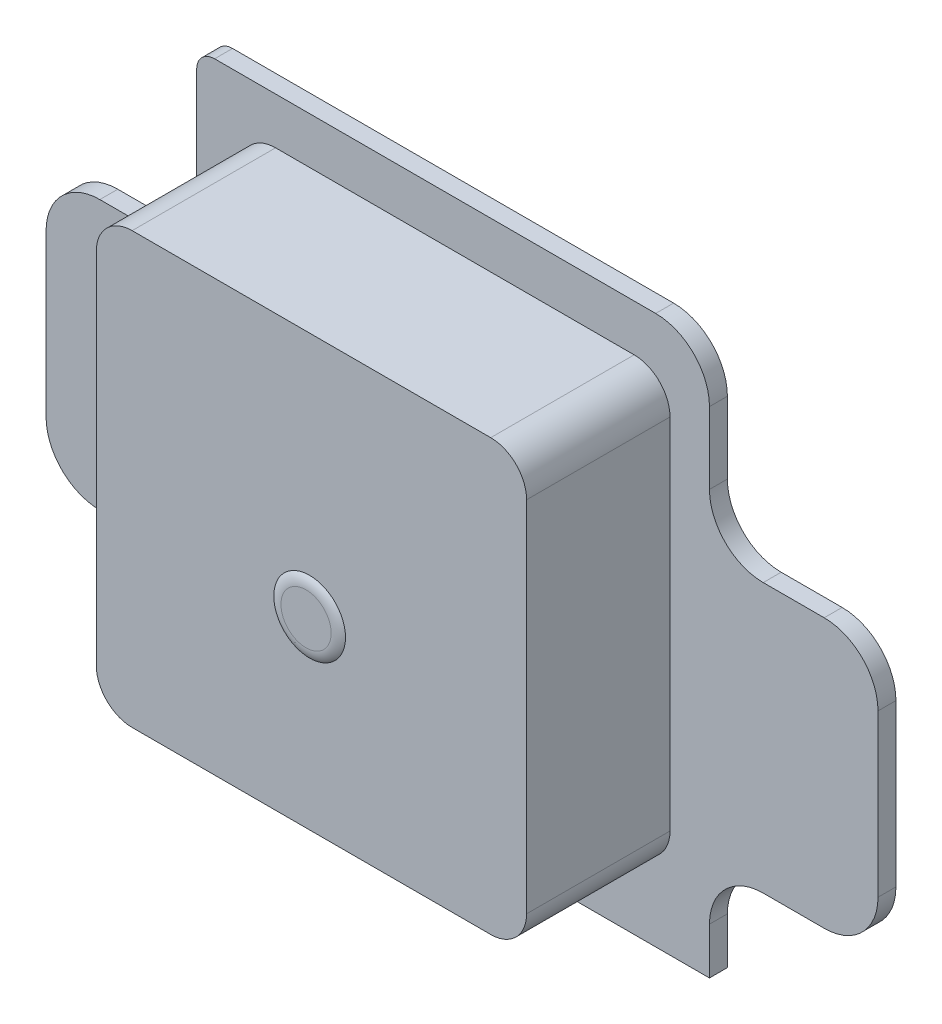
ISO-10303-21;
HEADER;
FILE_DESCRIPTION(('STEP AP214'),'2;1');
FILE_NAME('part.step','',(''),(''),'','','');
FILE_SCHEMA(('AUTOMOTIVE_DESIGN { 1 0 10303 214 1 1 1 1 }'));
ENDSEC;
DATA;
#1=APPLICATION_CONTEXT('core data for automotive mechanical design processes');
#2=APPLICATION_PROTOCOL_DEFINITION('international standard','automotive_design',2000,#1);
#3=PRODUCT_CONTEXT('',#1,'mechanical');
#4=PRODUCT('Part','Part','',(#3));
#5=PRODUCT_RELATED_PRODUCT_CATEGORY('part','',(#4));
#6=PRODUCT_DEFINITION_FORMATION('','',#4);
#7=PRODUCT_DEFINITION_CONTEXT('part definition',#1,'design');
#8=PRODUCT_DEFINITION('design','',#6,#7);
#9=PRODUCT_DEFINITION_SHAPE('','',#8);
#10=(LENGTH_UNIT() NAMED_UNIT(*) SI_UNIT(.MILLI.,.METRE.));
#11=(NAMED_UNIT(*) PLANE_ANGLE_UNIT() SI_UNIT($,.RADIAN.));
#12=(NAMED_UNIT(*) SI_UNIT($,.STERADIAN.) SOLID_ANGLE_UNIT());
#13=UNCERTAINTY_MEASURE_WITH_UNIT(LENGTH_MEASURE(1.E-05),#10,'distance_accuracy_value','');
#14=(GEOMETRIC_REPRESENTATION_CONTEXT(3) GLOBAL_UNCERTAINTY_ASSIGNED_CONTEXT((#13)) GLOBAL_UNIT_ASSIGNED_CONTEXT((#10,
#11,#12)) REPRESENTATION_CONTEXT('',''));
#15=CARTESIAN_POINT('',(0.,0.,0.));
#16=DIRECTION('',(0.,0.,1.));
#17=DIRECTION('',(1.,0.,0.));
#18=AXIS2_PLACEMENT_3D('',#15,#16,#17);
#19=CARTESIAN_POINT('',(0.,0.,0.5));
#20=DIRECTION('',(0.,0.,-1.));
#21=DIRECTION('',(-1.,0.,0.));
#22=AXIS2_PLACEMENT_3D('',#19,#20,#21);
#23=PLANE('',#22);
#24=DIRECTION('',(-1.,0.,0.));
#25=VECTOR('',#24,1.);
#26=CARTESIAN_POINT('',(-7.15,7.65,0.5));
#27=LINE('',#26,#25);
#28=CARTESIAN_POINT('',(5.65,7.65,0.5));
#29=VERTEX_POINT('',#28);
#30=CARTESIAN_POINT('',(-6.65,7.65,0.5));
#31=VERTEX_POINT('',#30);
#32=EDGE_CURVE('E243',#29,#31,#27,.T.);
#33=ORIENTED_EDGE('',*,*,#32,.T.);
#34=CARTESIAN_POINT('',(-6.65,7.15,0.5));
#35=DIRECTION('',(0.,0.,-1.));
#36=DIRECTION('',(-1.,0.,0.));
#37=AXIS2_PLACEMENT_3D('',#34,#35,#36);
#38=CIRCLE('',#37,0.5);
#39=CARTESIAN_POINT('',(-7.15,7.15,0.5));
#40=VERTEX_POINT('',#39);
#41=EDGE_CURVE('E361',#31,#40,#38,.F.);
#42=ORIENTED_EDGE('',*,*,#41,.T.);
#43=DIRECTION('',(0.,-1.,0.));
#44=VECTOR('',#43,1.);
#45=CARTESIAN_POINT('',(-7.15,-7.65,0.5));
#46=LINE('',#45,#44);
#47=CARTESIAN_POINT('',(-7.15,4.15,0.5));
#48=VERTEX_POINT('',#47);
#49=EDGE_CURVE('E242',#40,#48,#46,.T.);
#50=ORIENTED_EDGE('',*,*,#49,.T.);
#51=CARTESIAN_POINT('',(-8.65,4.15,0.5));
#52=DIRECTION('',(0.,0.,-1.));
#53=DIRECTION('',(-1.,0.,0.));
#54=AXIS2_PLACEMENT_3D('',#51,#52,#53);
#55=CIRCLE('',#54,1.5);
#56=CARTESIAN_POINT('',(-8.65,2.65,0.5));
#57=VERTEX_POINT('',#56);
#58=EDGE_CURVE('E349',#48,#57,#55,.T.);
#59=ORIENTED_EDGE('',*,*,#58,.T.);
#60=DIRECTION('',(-1.,0.,0.));
#61=VECTOR('',#60,1.);
#62=CARTESIAN_POINT('',(-7.15,2.65,0.5));
#63=LINE('',#62,#61);
#64=CARTESIAN_POINT('',(-9.85,2.65,0.5));
#65=VERTEX_POINT('',#64);
#66=EDGE_CURVE('E445',#57,#65,#63,.T.);
#67=ORIENTED_EDGE('',*,*,#66,.T.);
#68=CARTESIAN_POINT('',(-9.85,1.15,0.5));
#69=DIRECTION('',(0.,0.,-1.));
#70=DIRECTION('',(-1.,0.,0.));
#71=AXIS2_PLACEMENT_3D('',#68,#69,#70);
#72=CIRCLE('',#71,1.5);
#73=CARTESIAN_POINT('',(-11.35,1.15,0.5));
#74=VERTEX_POINT('',#73);
#75=EDGE_CURVE('E290',#65,#74,#72,.F.);
#76=ORIENTED_EDGE('',*,*,#75,.T.);
#77=DIRECTION('',(0.,-1.,0.));
#78=VECTOR('',#77,1.);
#79=CARTESIAN_POINT('',(-11.35,2.65,0.5));
#80=LINE('',#79,#78);
#81=CARTESIAN_POINT('',(-11.35,-3.35,0.5));
#82=VERTEX_POINT('',#81);
#83=EDGE_CURVE('E465',#74,#82,#80,.T.);
#84=ORIENTED_EDGE('',*,*,#83,.T.);
#85=CARTESIAN_POINT('',(-9.85,-3.35,0.5));
#86=DIRECTION('',(0.,0.,-1.));
#87=DIRECTION('',(-1.,0.,0.));
#88=AXIS2_PLACEMENT_3D('',#85,#86,#87);
#89=CIRCLE('',#88,1.5);
#90=CARTESIAN_POINT('',(-9.85,-4.85,0.5));
#91=VERTEX_POINT('',#90);
#92=EDGE_CURVE('E292',#82,#91,#89,.F.);
#93=ORIENTED_EDGE('',*,*,#92,.T.);
#94=DIRECTION('',(1.,0.,0.));
#95=VECTOR('',#94,1.);
#96=CARTESIAN_POINT('',(-7.15,-4.85,0.5));
#97=LINE('',#96,#95);
#98=CARTESIAN_POINT('',(-8.65,-4.85,0.5));
#99=VERTEX_POINT('',#98);
#100=EDGE_CURVE('E457',#91,#99,#97,.T.);
#101=ORIENTED_EDGE('',*,*,#100,.T.);
#102=CARTESIAN_POINT('',(-8.65,-6.35,0.5));
#103=DIRECTION('',(0.,0.,-1.));
#104=DIRECTION('',(-1.,0.,0.));
#105=AXIS2_PLACEMENT_3D('',#102,#103,#104);
#106=CIRCLE('',#105,1.5);
#107=CARTESIAN_POINT('',(-7.15,-6.35,0.5));
#108=VERTEX_POINT('',#107);
#109=EDGE_CURVE('E239',#99,#108,#106,.T.);
#110=ORIENTED_EDGE('',*,*,#109,.T.);
#111=CARTESIAN_POINT('',(-7.15,-7.65,0.5));
#112=VERTEX_POINT('',#111);
#113=EDGE_CURVE('E231',#108,#112,#46,.T.);
#114=ORIENTED_EDGE('',*,*,#113,.T.);
#115=DIRECTION('',(1.,0.,0.));
#116=VECTOR('',#115,1.);
#117=CARTESIAN_POINT('',(-7.15,-7.65,0.5));
#118=LINE('',#117,#116);
#119=CARTESIAN_POINT('',(7.15,-7.65,0.5));
#120=VERTEX_POINT('',#119);
#121=EDGE_CURVE('E236',#112,#120,#118,.T.);
#122=ORIENTED_EDGE('',*,*,#121,.T.);
#123=DIRECTION('',(0.,1.,0.));
#124=VECTOR('',#123,1.);
#125=CARTESIAN_POINT('',(7.15,-7.65,0.5));
#126=LINE('',#125,#124);
#127=CARTESIAN_POINT('',(7.15,-6.35,0.5));
#128=VERTEX_POINT('',#127);
#129=EDGE_CURVE('E469',#120,#128,#126,.T.);
#130=ORIENTED_EDGE('',*,*,#129,.T.);
#131=CARTESIAN_POINT('',(8.65,-6.35,0.5));
#132=DIRECTION('',(0.,0.,-1.));
#133=DIRECTION('',(-1.,0.,0.));
#134=AXIS2_PLACEMENT_3D('',#131,#132,#133);
#135=CIRCLE('',#134,1.5);
#136=CARTESIAN_POINT('',(8.65,-4.85,0.5));
#137=VERTEX_POINT('',#136);
#138=EDGE_CURVE('E342',#128,#137,#135,.T.);
#139=ORIENTED_EDGE('',*,*,#138,.T.);
#140=DIRECTION('',(1.,0.,0.));
#141=VECTOR('',#140,1.);
#142=CARTESIAN_POINT('',(7.15,-4.85,0.5));
#143=LINE('',#142,#141);
#144=CARTESIAN_POINT('',(10.35,-4.85,0.5));
#145=VERTEX_POINT('',#144);
#146=EDGE_CURVE('E427',#137,#145,#143,.T.);
#147=ORIENTED_EDGE('',*,*,#146,.T.);
#148=CARTESIAN_POINT('',(10.35,-3.35,0.5));
#149=DIRECTION('',(0.,0.,-1.));
#150=DIRECTION('',(-1.,0.,0.));
#151=AXIS2_PLACEMENT_3D('',#148,#149,#150);
#152=CIRCLE('',#151,1.5);
#153=CARTESIAN_POINT('',(11.85,-3.35,0.5));
#154=VERTEX_POINT('',#153);
#155=EDGE_CURVE('E294',#145,#154,#152,.F.);
#156=ORIENTED_EDGE('',*,*,#155,.T.);
#157=DIRECTION('',(0.,1.,0.));
#158=VECTOR('',#157,1.);
#159=CARTESIAN_POINT('',(11.85,2.65,0.5));
#160=LINE('',#159,#158);
#161=CARTESIAN_POINT('',(11.85,1.15,0.5));
#162=VERTEX_POINT('',#161);
#163=EDGE_CURVE('E448',#154,#162,#160,.T.);
#164=ORIENTED_EDGE('',*,*,#163,.T.);
#165=CARTESIAN_POINT('',(10.35,1.15,0.5));
#166=DIRECTION('',(0.,0.,-1.));
#167=DIRECTION('',(-1.,0.,0.));
#168=AXIS2_PLACEMENT_3D('',#165,#166,#167);
#169=CIRCLE('',#168,1.5);
#170=CARTESIAN_POINT('',(10.35,2.65,0.5));
#171=VERTEX_POINT('',#170);
#172=EDGE_CURVE('E296',#162,#171,#169,.F.);
#173=ORIENTED_EDGE('',*,*,#172,.T.);
#174=DIRECTION('',(-1.,0.,0.));
#175=VECTOR('',#174,1.);
#176=CARTESIAN_POINT('',(7.15,2.65,0.5));
#177=LINE('',#176,#175);
#178=CARTESIAN_POINT('',(8.65,2.65,0.5));
#179=VERTEX_POINT('',#178);
#180=EDGE_CURVE('E439',#171,#179,#177,.T.);
#181=ORIENTED_EDGE('',*,*,#180,.T.);
#182=CARTESIAN_POINT('',(8.65,4.15,0.5));
#183=DIRECTION('',(0.,0.,-1.));
#184=DIRECTION('',(-1.,0.,0.));
#185=AXIS2_PLACEMENT_3D('',#182,#183,#184);
#186=CIRCLE('',#185,1.5);
#187=CARTESIAN_POINT('',(7.15,4.15,0.5));
#188=VERTEX_POINT('',#187);
#189=EDGE_CURVE('E338',#179,#188,#186,.T.);
#190=ORIENTED_EDGE('',*,*,#189,.T.);
#191=CARTESIAN_POINT('',(7.15,6.15,0.5));
#192=VERTEX_POINT('',#191);
#193=EDGE_CURVE('E272',#188,#192,#126,.T.);
#194=ORIENTED_EDGE('',*,*,#193,.T.);
#195=CARTESIAN_POINT('',(5.65,6.15,0.5));
#196=DIRECTION('',(0.,0.,-1.));
#197=DIRECTION('',(-1.,0.,0.));
#198=AXIS2_PLACEMENT_3D('',#195,#196,#197);
#199=CIRCLE('',#198,1.5);
#200=EDGE_CURVE('E298',#192,#29,#199,.F.);
#201=ORIENTED_EDGE('',*,*,#200,.T.);
#202=EDGE_LOOP('',(#33,#42,#50,#59,#67,#76,#84,#93,#101,#110,#114,#122,#130,#139,#147,#156,#164,
#173,#181,#190,#194,#201));
#203=FACE_BOUND('',#202,.T.);
#204=DIRECTION('',(0.,-1.,0.));
#205=VECTOR('',#204,1.);
#206=CARTESIAN_POINT('',(-5.95,6.35,0.5));
#207=LINE('',#206,#205);
#208=CARTESIAN_POINT('',(-5.95,5.35,0.5));
#209=VERTEX_POINT('',#208);
#210=CARTESIAN_POINT('',(-5.94999999999999,-4.65,0.5));
#211=VERTEX_POINT('',#210);
#212=EDGE_CURVE('E396',#209,#211,#207,.T.);
#213=ORIENTED_EDGE('',*,*,#212,.F.);
#214=CARTESIAN_POINT('',(-4.95,5.35,0.5));
#215=DIRECTION('',(0.,0.,-1.));
#216=DIRECTION('',(-1.,0.,0.));
#217=AXIS2_PLACEMENT_3D('',#214,#215,#216);
#218=CIRCLE('',#217,1.);
#219=CARTESIAN_POINT('',(-4.95,6.35,0.5));
#220=VERTEX_POINT('',#219);
#221=EDGE_CURVE('E390',#209,#220,#218,.T.);
#222=ORIENTED_EDGE('',*,*,#221,.T.);
#223=DIRECTION('',(-1.,0.,0.));
#224=VECTOR('',#223,1.);
#225=CARTESIAN_POINT('',(-5.95,6.35,0.5));
#226=LINE('',#225,#224);
#227=CARTESIAN_POINT('',(5.05,6.35,0.5));
#228=VERTEX_POINT('',#227);
#229=EDGE_CURVE('E423',#228,#220,#226,.T.);
#230=ORIENTED_EDGE('',*,*,#229,.F.);
#231=CARTESIAN_POINT('',(5.05,5.35,0.5));
#232=DIRECTION('',(0.,0.,-1.));
#233=DIRECTION('',(-1.,0.,0.));
#234=AXIS2_PLACEMENT_3D('',#231,#232,#233);
#235=CIRCLE('',#234,1.);
#236=CARTESIAN_POINT('',(6.05,5.35,0.5));
#237=VERTEX_POINT('',#236);
#238=EDGE_CURVE('E392',#228,#237,#235,.T.);
#239=ORIENTED_EDGE('',*,*,#238,.T.);
#240=DIRECTION('',(0.,1.,0.));
#241=VECTOR('',#240,1.);
#242=CARTESIAN_POINT('',(6.05,6.35,0.5));
#243=LINE('',#242,#241);
#244=CARTESIAN_POINT('',(6.05000000000001,-4.65,0.5));
#245=VERTEX_POINT('',#244);
#246=EDGE_CURVE('E430',#245,#237,#243,.T.);
#247=ORIENTED_EDGE('',*,*,#246,.F.);
#248=CARTESIAN_POINT('',(5.05000000000001,-4.65,0.5));
#249=DIRECTION('',(0.,0.,-1.));
#250=DIRECTION('',(-1.,0.,0.));
#251=AXIS2_PLACEMENT_3D('',#248,#249,#250);
#252=CIRCLE('',#251,1.);
#253=CARTESIAN_POINT('',(5.05000000000001,-5.65,0.5));
#254=VERTEX_POINT('',#253);
#255=EDGE_CURVE('E49',#245,#254,#252,.T.);
#256=ORIENTED_EDGE('',*,*,#255,.T.);
#257=DIRECTION('',(1.,0.,0.));
#258=VECTOR('',#257,1.);
#259=CARTESIAN_POINT('',(-5.94999999999999,-5.65,0.5));
#260=LINE('',#259,#258);
#261=CARTESIAN_POINT('',(-4.94999999999999,-5.65,0.5));
#262=VERTEX_POINT('',#261);
#263=EDGE_CURVE('E397',#262,#254,#260,.T.);
#264=ORIENTED_EDGE('',*,*,#263,.F.);
#265=CARTESIAN_POINT('',(-4.94999999999999,-4.65,0.5));
#266=DIRECTION('',(0.,0.,-1.));
#267=DIRECTION('',(-1.,0.,0.));
#268=AXIS2_PLACEMENT_3D('',#265,#266,#267);
#269=CIRCLE('',#268,1.);
#270=EDGE_CURVE('E42',#262,#211,#269,.T.);
#271=ORIENTED_EDGE('',*,*,#270,.T.);
#272=EDGE_LOOP('',(#213,#222,#230,#239,#247,#256,#264,#271));
#273=FACE_BOUND('',#272,.T.);
#274=ADVANCED_FACE('F34',(#203,#273),#23,.F.);
#275=CARTESIAN_POINT('',(7.15,-7.65,0.5));
#276=DIRECTION('',(-1.,0.,0.));
#277=DIRECTION('',(0.,0.,1.));
#278=AXIS2_PLACEMENT_3D('',#275,#276,#277);
#279=PLANE('',#278);
#280=DIRECTION('',(0.,1.,0.));
#281=VECTOR('',#280,1.);
#282=CARTESIAN_POINT('',(7.15,-7.65,0.));
#283=LINE('',#282,#281);
#284=CARTESIAN_POINT('',(7.15,4.15,0.));
#285=VERTEX_POINT('',#284);
#286=CARTESIAN_POINT('',(7.15,6.15,0.));
#287=VERTEX_POINT('',#286);
#288=EDGE_CURVE('E266',#285,#287,#283,.T.);
#289=ORIENTED_EDGE('',*,*,#288,.T.);
#290=DIRECTION('',(0.,0.,-1.));
#291=VECTOR('',#290,1.);
#292=CARTESIAN_POINT('',(7.15,6.15,0.5));
#293=LINE('',#292,#291);
#294=EDGE_CURVE('E288',#287,#192,#293,.F.);
#295=ORIENTED_EDGE('',*,*,#294,.T.);
#296=ORIENTED_EDGE('',*,*,#193,.F.);
#297=DIRECTION('',(0.,0.,1.));
#298=VECTOR('',#297,1.);
#299=CARTESIAN_POINT('',(7.15,4.15,0.5));
#300=LINE('',#299,#298);
#301=EDGE_CURVE('E286',#188,#285,#300,.F.);
#302=ORIENTED_EDGE('',*,*,#301,.T.);
#303=EDGE_LOOP('',(#289,#295,#296,#302));
#304=FACE_BOUND('',#303,.T.);
#305=ADVANCED_FACE('F557',(#304),#279,.F.);
#306=CARTESIAN_POINT('',(-7.15,-7.65,0.5));
#307=DIRECTION('',(1.,0.,0.));
#308=DIRECTION('',(0.,0.,-1.));
#309=AXIS2_PLACEMENT_3D('',#306,#307,#308);
#310=PLANE('',#309);
#311=ORIENTED_EDGE('',*,*,#113,.F.);
#312=DIRECTION('',(0.,0.,1.));
#313=VECTOR('',#312,1.);
#314=CARTESIAN_POINT('',(-7.15,-6.35,0.5));
#315=LINE('',#314,#313);
#316=CARTESIAN_POINT('',(-7.15,-6.35,0.));
#317=VERTEX_POINT('',#316);
#318=EDGE_CURVE('E323',#108,#317,#315,.F.);
#319=ORIENTED_EDGE('',*,*,#318,.T.);
#320=DIRECTION('',(0.,-1.,0.));
#321=VECTOR('',#320,1.);
#322=CARTESIAN_POINT('',(-7.15,-7.65,0.));
#323=LINE('',#322,#321);
#324=CARTESIAN_POINT('',(-7.15,-7.65,0.));
#325=VERTEX_POINT('',#324);
#326=EDGE_CURVE('E249',#317,#325,#323,.T.);
#327=ORIENTED_EDGE('',*,*,#326,.T.);
#328=DIRECTION('',(0.,0.,-1.));
#329=VECTOR('',#328,1.);
#330=CARTESIAN_POINT('',(-7.15,-7.65,0.5));
#331=LINE('',#330,#329);
#332=EDGE_CURVE('E246',#112,#325,#331,.T.);
#333=ORIENTED_EDGE('',*,*,#332,.F.);
#334=EDGE_LOOP('',(#311,#319,#327,#333));
#335=FACE_BOUND('',#334,.T.);
#336=ADVANCED_FACE('F247',(#335),#310,.F.);
#337=CARTESIAN_POINT('',(7.15,-7.65,0.));
#338=VERTEX_POINT('',#337);
#339=CARTESIAN_POINT('',(7.15,-6.35,0.));
#340=VERTEX_POINT('',#339);
#341=EDGE_CURVE('E262',#338,#340,#283,.T.);
#342=ORIENTED_EDGE('',*,*,#341,.T.);
#343=DIRECTION('',(0.,0.,1.));
#344=VECTOR('',#343,1.);
#345=CARTESIAN_POINT('',(7.15,-6.35,0.5));
#346=LINE('',#345,#344);
#347=EDGE_CURVE('E315',#340,#128,#346,.T.);
#348=ORIENTED_EDGE('',*,*,#347,.T.);
#349=ORIENTED_EDGE('',*,*,#129,.F.);
#350=DIRECTION('',(0.,0.,-1.));
#351=VECTOR('',#350,1.);
#352=CARTESIAN_POINT('',(7.15,-7.65,0.5));
#353=LINE('',#352,#351);
#354=EDGE_CURVE('E253',#120,#338,#353,.T.);
#355=ORIENTED_EDGE('',*,*,#354,.T.);
#356=EDGE_LOOP('',(#342,#348,#349,#355));
#357=FACE_BOUND('',#356,.T.);
#358=ADVANCED_FACE('F521',(#357),#279,.F.);
#359=CARTESIAN_POINT('',(-7.15,7.65,0.5));
#360=DIRECTION('',(0.,-1.,0.));
#361=DIRECTION('',(0.,0.,-1.));
#362=AXIS2_PLACEMENT_3D('',#359,#360,#361);
#363=PLANE('',#362);
#364=DIRECTION('',(-1.,0.,0.));
#365=VECTOR('',#364,1.);
#366=CARTESIAN_POINT('',(-7.15,7.65,0.));
#367=LINE('',#366,#365);
#368=CARTESIAN_POINT('',(5.65,7.65,0.));
#369=VERTEX_POINT('',#368);
#370=CARTESIAN_POINT('',(-6.65,7.65,0.));
#371=VERTEX_POINT('',#370);
#372=EDGE_CURVE('E265',#369,#371,#367,.T.);
#373=ORIENTED_EDGE('',*,*,#372,.T.);
#374=DIRECTION('',(0.,0.,-1.));
#375=VECTOR('',#374,1.);
#376=CARTESIAN_POINT('',(-6.65,7.65,0.5));
#377=LINE('',#376,#375);
#378=EDGE_CURVE('E359',#371,#31,#377,.F.);
#379=ORIENTED_EDGE('',*,*,#378,.T.);
#380=ORIENTED_EDGE('',*,*,#32,.F.);
#381=DIRECTION('',(0.,0.,-1.));
#382=VECTOR('',#381,1.);
#383=CARTESIAN_POINT('',(5.65,7.65,0.5));
#384=LINE('',#383,#382);
#385=EDGE_CURVE('E252',#29,#369,#384,.T.);
#386=ORIENTED_EDGE('',*,*,#385,.T.);
#387=EDGE_LOOP('',(#373,#379,#380,#386));
#388=FACE_BOUND('',#387,.T.);
#389=ADVANCED_FACE('F562',(#388),#363,.F.);
#390=ORIENTED_EDGE('',*,*,#49,.F.);
#391=DIRECTION('',(0.,0.,-1.));
#392=VECTOR('',#391,1.);
#393=CARTESIAN_POINT('',(-7.15,7.15,0.5));
#394=LINE('',#393,#392);
#395=CARTESIAN_POINT('',(-7.15,7.15,0.));
#396=VERTEX_POINT('',#395);
#397=EDGE_CURVE('E354',#40,#396,#394,.T.);
#398=ORIENTED_EDGE('',*,*,#397,.T.);
#399=CARTESIAN_POINT('',(-7.15,4.15,0.));
#400=VERTEX_POINT('',#399);
#401=EDGE_CURVE('E269',#396,#400,#323,.T.);
#402=ORIENTED_EDGE('',*,*,#401,.T.);
#403=DIRECTION('',(0.,0.,1.));
#404=VECTOR('',#403,1.);
#405=CARTESIAN_POINT('',(-7.15,4.15,0.5));
#406=LINE('',#405,#404);
#407=EDGE_CURVE('E335',#400,#48,#406,.T.);
#408=ORIENTED_EDGE('',*,*,#407,.T.);
#409=EDGE_LOOP('',(#390,#398,#402,#408));
#410=FACE_BOUND('',#409,.T.);
#411=ADVANCED_FACE('F483',(#410),#310,.F.);
#412=CARTESIAN_POINT('',(-7.15,-7.65,0.5));
#413=DIRECTION('',(0.,1.,0.));
#414=DIRECTION('',(0.,0.,1.));
#415=AXIS2_PLACEMENT_3D('',#412,#413,#414);
#416=PLANE('',#415);
#417=DIRECTION('',(1.,0.,0.));
#418=VECTOR('',#417,1.);
#419=CARTESIAN_POINT('',(-7.15,-7.65,0.));
#420=LINE('',#419,#418);
#421=EDGE_CURVE('E271',#325,#338,#420,.T.);
#422=ORIENTED_EDGE('',*,*,#421,.T.);
#423=ORIENTED_EDGE('',*,*,#354,.F.);
#424=ORIENTED_EDGE('',*,*,#121,.F.);
#425=ORIENTED_EDGE('',*,*,#332,.T.);
#426=EDGE_LOOP('',(#422,#423,#424,#425));
#427=FACE_BOUND('',#426,.T.);
#428=ADVANCED_FACE('F255',(#427),#416,.F.);
#429=CARTESIAN_POINT('',(0.,0.,0.));
#430=DIRECTION('',(0.,0.,-1.));
#431=DIRECTION('',(-1.,0.,0.));
#432=AXIS2_PLACEMENT_3D('',#429,#430,#431);
#433=PLANE('',#432);
#434=ORIENTED_EDGE('',*,*,#401,.F.);
#435=CARTESIAN_POINT('',(-6.65,7.15,0.));
#436=DIRECTION('',(0.,0.,-1.));
#437=DIRECTION('',(-1.,0.,0.));
#438=AXIS2_PLACEMENT_3D('',#435,#436,#437);
#439=CIRCLE('',#438,0.5);
#440=EDGE_CURVE('E357',#396,#371,#439,.T.);
#441=ORIENTED_EDGE('',*,*,#440,.T.);
#442=ORIENTED_EDGE('',*,*,#372,.F.);
#443=CARTESIAN_POINT('',(5.65,6.15,0.));
#444=DIRECTION('',(0.,0.,-1.));
#445=DIRECTION('',(-1.,0.,0.));
#446=AXIS2_PLACEMENT_3D('',#443,#444,#445);
#447=CIRCLE('',#446,1.5);
#448=EDGE_CURVE('E284',#369,#287,#447,.T.);
#449=ORIENTED_EDGE('',*,*,#448,.T.);
#450=ORIENTED_EDGE('',*,*,#288,.F.);
#451=CARTESIAN_POINT('',(8.65,4.15,0.));
#452=DIRECTION('',(0.,0.,-1.));
#453=DIRECTION('',(-1.,0.,0.));
#454=AXIS2_PLACEMENT_3D('',#451,#452,#453);
#455=CIRCLE('',#454,1.5);
#456=CARTESIAN_POINT('',(8.65,2.65,0.));
#457=VERTEX_POINT('',#456);
#458=EDGE_CURVE('E340',#285,#457,#455,.F.);
#459=ORIENTED_EDGE('',*,*,#458,.T.);
#460=DIRECTION('',(-1.,0.,0.));
#461=VECTOR('',#460,1.);
#462=CARTESIAN_POINT('',(7.15,2.65,0.));
#463=LINE('',#462,#461);
#464=CARTESIAN_POINT('',(10.35,2.65,0.));
#465=VERTEX_POINT('',#464);
#466=EDGE_CURVE('E442',#465,#457,#463,.T.);
#467=ORIENTED_EDGE('',*,*,#466,.F.);
#468=CARTESIAN_POINT('',(10.35,1.15,0.));
#469=DIRECTION('',(0.,0.,-1.));
#470=DIRECTION('',(-1.,0.,0.));
#471=AXIS2_PLACEMENT_3D('',#468,#469,#470);
#472=CIRCLE('',#471,1.5);
#473=CARTESIAN_POINT('',(11.85,1.15,0.));
#474=VERTEX_POINT('',#473);
#475=EDGE_CURVE('E282',#465,#474,#472,.T.);
#476=ORIENTED_EDGE('',*,*,#475,.T.);
#477=DIRECTION('',(0.,1.,0.));
#478=VECTOR('',#477,1.);
#479=CARTESIAN_POINT('',(11.85,2.65,0.));
#480=LINE('',#479,#478);
#481=CARTESIAN_POINT('',(11.85,-3.35,0.));
#482=VERTEX_POINT('',#481);
#483=EDGE_CURVE('E438',#482,#474,#480,.T.);
#484=ORIENTED_EDGE('',*,*,#483,.F.);
#485=CARTESIAN_POINT('',(10.35,-3.35,0.));
#486=DIRECTION('',(0.,0.,-1.));
#487=DIRECTION('',(-1.,0.,0.));
#488=AXIS2_PLACEMENT_3D('',#485,#486,#487);
#489=CIRCLE('',#488,1.5);
#490=CARTESIAN_POINT('',(10.35,-4.85,0.));
#491=VERTEX_POINT('',#490);
#492=EDGE_CURVE('E280',#482,#491,#489,.T.);
#493=ORIENTED_EDGE('',*,*,#492,.T.);
#494=DIRECTION('',(1.,0.,0.));
#495=VECTOR('',#494,1.);
#496=CARTESIAN_POINT('',(7.15,-4.85,0.));
#497=LINE('',#496,#495);
#498=CARTESIAN_POINT('',(8.65,-4.85,0.));
#499=VERTEX_POINT('',#498);
#500=EDGE_CURVE('E435',#499,#491,#497,.T.);
#501=ORIENTED_EDGE('',*,*,#500,.F.);
#502=CARTESIAN_POINT('',(8.65,-6.35,0.));
#503=DIRECTION('',(0.,0.,-1.));
#504=DIRECTION('',(-1.,0.,0.));
#505=AXIS2_PLACEMENT_3D('',#502,#503,#504);
#506=CIRCLE('',#505,1.5);
#507=EDGE_CURVE('E344',#499,#340,#506,.F.);
#508=ORIENTED_EDGE('',*,*,#507,.T.);
#509=ORIENTED_EDGE('',*,*,#341,.F.);
#510=ORIENTED_EDGE('',*,*,#421,.F.);
#511=ORIENTED_EDGE('',*,*,#326,.F.);
#512=CARTESIAN_POINT('',(-8.65,-6.35,0.));
#513=DIRECTION('',(0.,0.,-1.));
#514=DIRECTION('',(-1.,0.,0.));
#515=AXIS2_PLACEMENT_3D('',#512,#513,#514);
#516=CIRCLE('',#515,1.5);
#517=CARTESIAN_POINT('',(-8.65,-4.85,0.));
#518=VERTEX_POINT('',#517);
#519=EDGE_CURVE('E347',#317,#518,#516,.F.);
#520=ORIENTED_EDGE('',*,*,#519,.T.);
#521=DIRECTION('',(1.,0.,0.));
#522=VECTOR('',#521,1.);
#523=CARTESIAN_POINT('',(-7.15,-4.85,0.));
#524=LINE('',#523,#522);
#525=CARTESIAN_POINT('',(-9.85,-4.85,0.));
#526=VERTEX_POINT('',#525);
#527=EDGE_CURVE('E460',#526,#518,#524,.T.);
#528=ORIENTED_EDGE('',*,*,#527,.F.);
#529=CARTESIAN_POINT('',(-9.85,-3.35,0.));
#530=DIRECTION('',(0.,0.,-1.));
#531=DIRECTION('',(-1.,0.,0.));
#532=AXIS2_PLACEMENT_3D('',#529,#530,#531);
#533=CIRCLE('',#532,1.5);
#534=CARTESIAN_POINT('',(-11.35,-3.35,0.));
#535=VERTEX_POINT('',#534);
#536=EDGE_CURVE('E278',#526,#535,#533,.T.);
#537=ORIENTED_EDGE('',*,*,#536,.T.);
#538=DIRECTION('',(0.,-1.,0.));
#539=VECTOR('',#538,1.);
#540=CARTESIAN_POINT('',(-11.35,2.65,0.));
#541=LINE('',#540,#539);
#542=CARTESIAN_POINT('',(-11.35,1.15,0.));
#543=VERTEX_POINT('',#542);
#544=EDGE_CURVE('E456',#543,#535,#541,.T.);
#545=ORIENTED_EDGE('',*,*,#544,.F.);
#546=CARTESIAN_POINT('',(-9.85,1.15,0.));
#547=DIRECTION('',(0.,0.,-1.));
#548=DIRECTION('',(-1.,0.,0.));
#549=AXIS2_PLACEMENT_3D('',#546,#547,#548);
#550=CIRCLE('',#549,1.5);
#551=CARTESIAN_POINT('',(-9.85,2.65,0.));
#552=VERTEX_POINT('',#551);
#553=EDGE_CURVE('E276',#543,#552,#550,.T.);
#554=ORIENTED_EDGE('',*,*,#553,.T.);
#555=DIRECTION('',(-1.,0.,0.));
#556=VECTOR('',#555,1.);
#557=CARTESIAN_POINT('',(-7.15,2.65,0.));
#558=LINE('',#557,#556);
#559=CARTESIAN_POINT('',(-8.65,2.65,0.));
#560=VERTEX_POINT('',#559);
#561=EDGE_CURVE('E453',#560,#552,#558,.T.);
#562=ORIENTED_EDGE('',*,*,#561,.F.);
#563=CARTESIAN_POINT('',(-8.65,4.15,0.));
#564=DIRECTION('',(0.,0.,-1.));
#565=DIRECTION('',(-1.,0.,0.));
#566=AXIS2_PLACEMENT_3D('',#563,#564,#565);
#567=CIRCLE('',#566,1.5);
#568=EDGE_CURVE('E351',#560,#400,#567,.F.);
#569=ORIENTED_EDGE('',*,*,#568,.T.);
#570=EDGE_LOOP('',(#434,#441,#442,#449,#450,#459,#467,#476,#484,#493,#501,#508,#509,#510,#511,
#520,#528,#537,#545,#554,#562,#569));
#571=FACE_BOUND('',#570,.T.);
#572=ADVANCED_FACE('F485',(#571),#433,.T.);
#573=CARTESIAN_POINT('',(-7.15,-4.85,0.));
#574=DIRECTION('',(0.,-1.,0.));
#575=DIRECTION('',(1.,0.,0.));
#576=AXIS2_PLACEMENT_3D('',#573,#574,#575);
#577=PLANE('',#576);
#578=ORIENTED_EDGE('',*,*,#527,.T.);
#579=DIRECTION('',(0.,0.,1.));
#580=VECTOR('',#579,1.);
#581=CARTESIAN_POINT('',(-8.65,-4.85,0.));
#582=LINE('',#581,#580);
#583=EDGE_CURVE('E320',#518,#99,#582,.T.);
#584=ORIENTED_EDGE('',*,*,#583,.T.);
#585=ORIENTED_EDGE('',*,*,#100,.F.);
#586=DIRECTION('',(0.,0.,1.));
#587=VECTOR('',#586,1.);
#588=CARTESIAN_POINT('',(-9.85,-4.85,0.));
#589=LINE('',#588,#587);
#590=EDGE_CURVE('E318',#91,#526,#589,.F.);
#591=ORIENTED_EDGE('',*,*,#590,.T.);
#592=EDGE_LOOP('',(#578,#584,#585,#591));
#593=FACE_BOUND('',#592,.T.);
#594=ADVANCED_FACE('F513',(#593),#577,.T.);
#595=CARTESIAN_POINT('',(-11.35,2.65,0.));
#596=DIRECTION('',(-1.,0.,0.));
#597=DIRECTION('',(0.,0.,1.));
#598=AXIS2_PLACEMENT_3D('',#595,#596,#597);
#599=PLANE('',#598);
#600=ORIENTED_EDGE('',*,*,#544,.T.);
#601=DIRECTION('',(0.,0.,1.));
#602=VECTOR('',#601,1.);
#603=CARTESIAN_POINT('',(-11.35,-3.35,0.));
#604=LINE('',#603,#602);
#605=EDGE_CURVE('E327',#535,#82,#604,.T.);
#606=ORIENTED_EDGE('',*,*,#605,.T.);
#607=ORIENTED_EDGE('',*,*,#83,.F.);
#608=DIRECTION('',(0.,0.,1.));
#609=VECTOR('',#608,1.);
#610=CARTESIAN_POINT('',(-11.35,1.15,0.));
#611=LINE('',#610,#609);
#612=EDGE_CURVE('E325',#74,#543,#611,.F.);
#613=ORIENTED_EDGE('',*,*,#612,.T.);
#614=EDGE_LOOP('',(#600,#606,#607,#613));
#615=FACE_BOUND('',#614,.T.);
#616=ADVANCED_FACE('F504',(#615),#599,.T.);
#617=CARTESIAN_POINT('',(-7.15,2.65,0.));
#618=DIRECTION('',(0.,1.,0.));
#619=DIRECTION('',(0.,0.,1.));
#620=AXIS2_PLACEMENT_3D('',#617,#618,#619);
#621=PLANE('',#620);
#622=ORIENTED_EDGE('',*,*,#561,.T.);
#623=DIRECTION('',(0.,0.,1.));
#624=VECTOR('',#623,1.);
#625=CARTESIAN_POINT('',(-9.85,2.65,0.));
#626=LINE('',#625,#624);
#627=EDGE_CURVE('E332',#552,#65,#626,.T.);
#628=ORIENTED_EDGE('',*,*,#627,.T.);
#629=ORIENTED_EDGE('',*,*,#66,.F.);
#630=DIRECTION('',(0.,0.,1.));
#631=VECTOR('',#630,1.);
#632=CARTESIAN_POINT('',(-8.65,2.65,0.));
#633=LINE('',#632,#631);
#634=EDGE_CURVE('E330',#57,#560,#633,.F.);
#635=ORIENTED_EDGE('',*,*,#634,.T.);
#636=EDGE_LOOP('',(#622,#628,#629,#635));
#637=FACE_BOUND('',#636,.T.);
#638=ADVANCED_FACE('F496',(#637),#621,.T.);
#639=CARTESIAN_POINT('',(7.15,2.65,0.));
#640=DIRECTION('',(0.,1.,0.));
#641=DIRECTION('',(-1.,0.,0.));
#642=AXIS2_PLACEMENT_3D('',#639,#640,#641);
#643=PLANE('',#642);
#644=ORIENTED_EDGE('',*,*,#466,.T.);
#645=DIRECTION('',(0.,0.,1.));
#646=VECTOR('',#645,1.);
#647=CARTESIAN_POINT('',(8.65,2.65,0.));
#648=LINE('',#647,#646);
#649=EDGE_CURVE('E302',#457,#179,#648,.T.);
#650=ORIENTED_EDGE('',*,*,#649,.T.);
#651=ORIENTED_EDGE('',*,*,#180,.F.);
#652=DIRECTION('',(0.,0.,1.));
#653=VECTOR('',#652,1.);
#654=CARTESIAN_POINT('',(10.35,2.65,0.));
#655=LINE('',#654,#653);
#656=EDGE_CURVE('E300',#171,#465,#655,.F.);
#657=ORIENTED_EDGE('',*,*,#656,.T.);
#658=EDGE_LOOP('',(#644,#650,#651,#657));
#659=FACE_BOUND('',#658,.T.);
#660=ADVANCED_FACE('F547',(#659),#643,.T.);
#661=CARTESIAN_POINT('',(11.85,2.65,0.));
#662=DIRECTION('',(1.,0.,0.));
#663=DIRECTION('',(0.,0.,-1.));
#664=AXIS2_PLACEMENT_3D('',#661,#662,#663);
#665=PLANE('',#664);
#666=ORIENTED_EDGE('',*,*,#483,.T.);
#667=DIRECTION('',(0.,0.,1.));
#668=VECTOR('',#667,1.);
#669=CARTESIAN_POINT('',(11.85,1.15,0.));
#670=LINE('',#669,#668);
#671=EDGE_CURVE('E307',#474,#162,#670,.T.);
#672=ORIENTED_EDGE('',*,*,#671,.T.);
#673=ORIENTED_EDGE('',*,*,#163,.F.);
#674=DIRECTION('',(0.,0.,1.));
#675=VECTOR('',#674,1.);
#676=CARTESIAN_POINT('',(11.85,-3.35,0.));
#677=LINE('',#676,#675);
#678=EDGE_CURVE('E305',#154,#482,#677,.F.);
#679=ORIENTED_EDGE('',*,*,#678,.T.);
#680=EDGE_LOOP('',(#666,#672,#673,#679));
#681=FACE_BOUND('',#680,.T.);
#682=ADVANCED_FACE('F539',(#681),#665,.T.);
#683=CARTESIAN_POINT('',(7.15,-4.85,0.));
#684=DIRECTION('',(0.,-1.,0.));
#685=DIRECTION('',(0.,0.,-1.));
#686=AXIS2_PLACEMENT_3D('',#683,#684,#685);
#687=PLANE('',#686);
#688=ORIENTED_EDGE('',*,*,#500,.T.);
#689=DIRECTION('',(0.,0.,1.));
#690=VECTOR('',#689,1.);
#691=CARTESIAN_POINT('',(10.35,-4.85,0.));
#692=LINE('',#691,#690);
#693=EDGE_CURVE('E312',#491,#145,#692,.T.);
#694=ORIENTED_EDGE('',*,*,#693,.T.);
#695=ORIENTED_EDGE('',*,*,#146,.F.);
#696=DIRECTION('',(0.,0.,1.));
#697=VECTOR('',#696,1.);
#698=CARTESIAN_POINT('',(8.65,-4.85,0.));
#699=LINE('',#698,#697);
#700=EDGE_CURVE('E310',#137,#499,#699,.F.);
#701=ORIENTED_EDGE('',*,*,#700,.T.);
#702=EDGE_LOOP('',(#688,#694,#695,#701));
#703=FACE_BOUND('',#702,.T.);
#704=ADVANCED_FACE('F527',(#703),#687,.T.);
#705=CARTESIAN_POINT('',(5.65,6.15,0.5));
#706=DIRECTION('',(0.,0.,-1.));
#707=DIRECTION('',(-1.,0.,0.));
#708=AXIS2_PLACEMENT_3D('',#705,#706,#707);
#709=CYLINDRICAL_SURFACE('',#708,1.5);
#710=ORIENTED_EDGE('',*,*,#200,.F.);
#711=ORIENTED_EDGE('',*,*,#294,.F.);
#712=ORIENTED_EDGE('',*,*,#448,.F.);
#713=ORIENTED_EDGE('',*,*,#385,.F.);
#714=EDGE_LOOP('',(#710,#711,#712,#713));
#715=FACE_BOUND('',#714,.T.);
#716=ADVANCED_FACE('F561',(#715),#709,.T.);
#717=CARTESIAN_POINT('',(8.65,4.15,0.));
#718=DIRECTION('',(0.,0.,1.));
#719=DIRECTION('',(1.,0.,0.));
#720=AXIS2_PLACEMENT_3D('',#717,#718,#719);
#721=CYLINDRICAL_SURFACE('',#720,1.5);
#722=ORIENTED_EDGE('',*,*,#458,.F.);
#723=ORIENTED_EDGE('',*,*,#301,.F.);
#724=ORIENTED_EDGE('',*,*,#189,.F.);
#725=ORIENTED_EDGE('',*,*,#649,.F.);
#726=EDGE_LOOP('',(#722,#723,#724,#725));
#727=FACE_BOUND('',#726,.T.);
#728=ADVANCED_FACE('F552',(#727),#721,.F.);
#729=CARTESIAN_POINT('',(10.35,1.15,0.));
#730=DIRECTION('',(0.,0.,1.));
#731=DIRECTION('',(1.,0.,0.));
#732=AXIS2_PLACEMENT_3D('',#729,#730,#731);
#733=CYLINDRICAL_SURFACE('',#732,1.5);
#734=ORIENTED_EDGE('',*,*,#475,.F.);
#735=ORIENTED_EDGE('',*,*,#656,.F.);
#736=ORIENTED_EDGE('',*,*,#172,.F.);
#737=ORIENTED_EDGE('',*,*,#671,.F.);
#738=EDGE_LOOP('',(#734,#735,#736,#737));
#739=FACE_BOUND('',#738,.T.);
#740=ADVANCED_FACE('F543',(#739),#733,.T.);
#741=CARTESIAN_POINT('',(10.35,-3.35,0.));
#742=DIRECTION('',(0.,0.,1.));
#743=DIRECTION('',(1.,0.,0.));
#744=AXIS2_PLACEMENT_3D('',#741,#742,#743);
#745=CYLINDRICAL_SURFACE('',#744,1.5);
#746=ORIENTED_EDGE('',*,*,#492,.F.);
#747=ORIENTED_EDGE('',*,*,#678,.F.);
#748=ORIENTED_EDGE('',*,*,#155,.F.);
#749=ORIENTED_EDGE('',*,*,#693,.F.);
#750=EDGE_LOOP('',(#746,#747,#748,#749));
#751=FACE_BOUND('',#750,.T.);
#752=ADVANCED_FACE('F535',(#751),#745,.T.);
#753=CARTESIAN_POINT('',(8.65,-6.35,0.5));
#754=DIRECTION('',(0.,0.,1.));
#755=DIRECTION('',(1.,0.,0.));
#756=AXIS2_PLACEMENT_3D('',#753,#754,#755);
#757=CYLINDRICAL_SURFACE('',#756,1.5);
#758=ORIENTED_EDGE('',*,*,#507,.F.);
#759=ORIENTED_EDGE('',*,*,#700,.F.);
#760=ORIENTED_EDGE('',*,*,#138,.F.);
#761=ORIENTED_EDGE('',*,*,#347,.F.);
#762=EDGE_LOOP('',(#758,#759,#760,#761));
#763=FACE_BOUND('',#762,.T.);
#764=ADVANCED_FACE('F531',(#763),#757,.F.);
#765=CARTESIAN_POINT('',(-8.65,-6.35,0.));
#766=DIRECTION('',(0.,0.,1.));
#767=DIRECTION('',(1.,0.,0.));
#768=AXIS2_PLACEMENT_3D('',#765,#766,#767);
#769=CYLINDRICAL_SURFACE('',#768,1.5);
#770=ORIENTED_EDGE('',*,*,#519,.F.);
#771=ORIENTED_EDGE('',*,*,#318,.F.);
#772=ORIENTED_EDGE('',*,*,#109,.F.);
#773=ORIENTED_EDGE('',*,*,#583,.F.);
#774=EDGE_LOOP('',(#770,#771,#772,#773));
#775=FACE_BOUND('',#774,.T.);
#776=ADVANCED_FACE('F518',(#775),#769,.F.);
#777=CARTESIAN_POINT('',(-9.85,-3.35,0.));
#778=DIRECTION('',(0.,0.,1.));
#779=DIRECTION('',(1.,0.,0.));
#780=AXIS2_PLACEMENT_3D('',#777,#778,#779);
#781=CYLINDRICAL_SURFACE('',#780,1.5);
#782=ORIENTED_EDGE('',*,*,#536,.F.);
#783=ORIENTED_EDGE('',*,*,#590,.F.);
#784=ORIENTED_EDGE('',*,*,#92,.F.);
#785=ORIENTED_EDGE('',*,*,#605,.F.);
#786=EDGE_LOOP('',(#782,#783,#784,#785));
#787=FACE_BOUND('',#786,.T.);
#788=ADVANCED_FACE('F509',(#787),#781,.T.);
#789=CARTESIAN_POINT('',(-9.85,1.15,0.));
#790=DIRECTION('',(0.,0.,1.));
#791=DIRECTION('',(1.,0.,0.));
#792=AXIS2_PLACEMENT_3D('',#789,#790,#791);
#793=CYLINDRICAL_SURFACE('',#792,1.5);
#794=ORIENTED_EDGE('',*,*,#553,.F.);
#795=ORIENTED_EDGE('',*,*,#612,.F.);
#796=ORIENTED_EDGE('',*,*,#75,.F.);
#797=ORIENTED_EDGE('',*,*,#627,.F.);
#798=EDGE_LOOP('',(#794,#795,#796,#797));
#799=FACE_BOUND('',#798,.T.);
#800=ADVANCED_FACE('F500',(#799),#793,.T.);
#801=CARTESIAN_POINT('',(-8.65,4.15,0.5));
#802=DIRECTION('',(0.,0.,1.));
#803=DIRECTION('',(1.,0.,0.));
#804=AXIS2_PLACEMENT_3D('',#801,#802,#803);
#805=CYLINDRICAL_SURFACE('',#804,1.5);
#806=ORIENTED_EDGE('',*,*,#568,.F.);
#807=ORIENTED_EDGE('',*,*,#634,.F.);
#808=ORIENTED_EDGE('',*,*,#58,.F.);
#809=ORIENTED_EDGE('',*,*,#407,.F.);
#810=EDGE_LOOP('',(#806,#807,#808,#809));
#811=FACE_BOUND('',#810,.T.);
#812=ADVANCED_FACE('F493',(#811),#805,.F.);
#813=CARTESIAN_POINT('',(-6.65,7.15,0.5));
#814=DIRECTION('',(0.,0.,-1.));
#815=DIRECTION('',(-1.,0.,0.));
#816=AXIS2_PLACEMENT_3D('',#813,#814,#815);
#817=CYLINDRICAL_SURFACE('',#816,0.5);
#818=ORIENTED_EDGE('',*,*,#41,.F.);
#819=ORIENTED_EDGE('',*,*,#378,.F.);
#820=ORIENTED_EDGE('',*,*,#440,.F.);
#821=ORIENTED_EDGE('',*,*,#397,.F.);
#822=EDGE_LOOP('',(#818,#819,#820,#821));
#823=FACE_BOUND('',#822,.T.);
#824=ADVANCED_FACE('F480',(#823),#817,.T.);
#825=CARTESIAN_POINT('',(-5.95,6.35,4.5));
#826=DIRECTION('',(1.,0.,0.));
#827=DIRECTION('',(0.,1.,0.));
#828=AXIS2_PLACEMENT_3D('',#825,#826,#827);
#829=PLANE('',#828);
#830=DIRECTION('',(0.,-1.,0.));
#831=VECTOR('',#830,1.);
#832=CARTESIAN_POINT('',(-5.95,6.35,4.5));
#833=LINE('',#832,#831);
#834=CARTESIAN_POINT('',(-5.95,5.35,4.5));
#835=VERTEX_POINT('',#834);
#836=CARTESIAN_POINT('',(-5.94999999999999,-4.65,4.5));
#837=VERTEX_POINT('',#836);
#838=EDGE_CURVE('E414',#835,#837,#833,.T.);
#839=ORIENTED_EDGE('',*,*,#838,.F.);
#840=DIRECTION('',(0.,0.,-1.));
#841=VECTOR('',#840,1.);
#842=CARTESIAN_POINT('',(-5.95,5.35,4.5));
#843=LINE('',#842,#841);
#844=EDGE_CURVE('E365',#835,#209,#843,.T.);
#845=ORIENTED_EDGE('',*,*,#844,.T.);
#846=ORIENTED_EDGE('',*,*,#212,.T.);
#847=DIRECTION('',(0.,0.,-1.));
#848=VECTOR('',#847,1.);
#849=CARTESIAN_POINT('',(-5.94999999999999,-4.65,4.5));
#850=LINE('',#849,#848);
#851=EDGE_CURVE('E363',#211,#837,#850,.F.);
#852=ORIENTED_EDGE('',*,*,#851,.T.);
#853=EDGE_LOOP('',(#839,#845,#846,#852));
#854=FACE_BOUND('',#853,.T.);
#855=ADVANCED_FACE('F400',(#854),#829,.F.);
#856=CARTESIAN_POINT('',(-5.94999999999999,-5.65,4.5));
#857=DIRECTION('',(0.,1.,0.));
#858=DIRECTION('',(-1.,0.,0.));
#859=AXIS2_PLACEMENT_3D('',#856,#857,#858);
#860=PLANE('',#859);
#861=ORIENTED_EDGE('',*,*,#263,.T.);
#862=DIRECTION('',(0.,0.,-1.));
#863=VECTOR('',#862,1.);
#864=CARTESIAN_POINT('',(5.05000000000001,-5.65,4.5));
#865=LINE('',#864,#863);
#866=CARTESIAN_POINT('',(5.05000000000001,-5.65,4.5));
#867=VERTEX_POINT('',#866);
#868=EDGE_CURVE('E388',#254,#867,#865,.F.);
#869=ORIENTED_EDGE('',*,*,#868,.T.);
#870=DIRECTION('',(1.,0.,0.));
#871=VECTOR('',#870,1.);
#872=CARTESIAN_POINT('',(-5.94999999999999,-5.65,4.5));
#873=LINE('',#872,#871);
#874=CARTESIAN_POINT('',(-4.94999999999999,-5.65,4.5));
#875=VERTEX_POINT('',#874);
#876=EDGE_CURVE('E412',#875,#867,#873,.T.);
#877=ORIENTED_EDGE('',*,*,#876,.F.);
#878=DIRECTION('',(0.,0.,-1.));
#879=VECTOR('',#878,1.);
#880=CARTESIAN_POINT('',(-4.94999999999999,-5.65,4.5));
#881=LINE('',#880,#879);
#882=EDGE_CURVE('E386',#875,#262,#881,.T.);
#883=ORIENTED_EDGE('',*,*,#882,.T.);
#884=EDGE_LOOP('',(#861,#869,#877,#883));
#885=FACE_BOUND('',#884,.T.);
#886=ADVANCED_FACE('F416',(#885),#860,.F.);
#887=CARTESIAN_POINT('',(6.05,6.35,4.5));
#888=DIRECTION('',(-1.,0.,0.));
#889=DIRECTION('',(0.,-1.,0.));
#890=AXIS2_PLACEMENT_3D('',#887,#888,#889);
#891=PLANE('',#890);
#892=ORIENTED_EDGE('',*,*,#246,.T.);
#893=DIRECTION('',(0.,0.,-1.));
#894=VECTOR('',#893,1.);
#895=CARTESIAN_POINT('',(6.05,5.35,4.5));
#896=LINE('',#895,#894);
#897=CARTESIAN_POINT('',(6.05,5.35,4.5));
#898=VERTEX_POINT('',#897);
#899=EDGE_CURVE('E384',#237,#898,#896,.F.);
#900=ORIENTED_EDGE('',*,*,#899,.T.);
#901=DIRECTION('',(0.,1.,0.));
#902=VECTOR('',#901,1.);
#903=CARTESIAN_POINT('',(6.05,6.35,4.5));
#904=LINE('',#903,#902);
#905=CARTESIAN_POINT('',(6.05000000000001,-4.65,4.5));
#906=VERTEX_POINT('',#905);
#907=EDGE_CURVE('E418',#906,#898,#904,.T.);
#908=ORIENTED_EDGE('',*,*,#907,.F.);
#909=DIRECTION('',(0.,0.,-1.));
#910=VECTOR('',#909,1.);
#911=CARTESIAN_POINT('',(6.05000000000001,-4.65,4.5));
#912=LINE('',#911,#910);
#913=EDGE_CURVE('E381',#906,#245,#912,.T.);
#914=ORIENTED_EDGE('',*,*,#913,.T.);
#915=EDGE_LOOP('',(#892,#900,#908,#914));
#916=FACE_BOUND('',#915,.T.);
#917=ADVANCED_FACE('F698',(#916),#891,.F.);
#918=CARTESIAN_POINT('',(-5.95,6.35,4.5));
#919=DIRECTION('',(0.,-1.,0.));
#920=DIRECTION('',(1.,0.,0.));
#921=AXIS2_PLACEMENT_3D('',#918,#919,#920);
#922=PLANE('',#921);
#923=ORIENTED_EDGE('',*,*,#229,.T.);
#924=DIRECTION('',(0.,0.,-1.));
#925=VECTOR('',#924,1.);
#926=CARTESIAN_POINT('',(-4.95,6.35,4.5));
#927=LINE('',#926,#925);
#928=CARTESIAN_POINT('',(-4.95,6.35,4.5));
#929=VERTEX_POINT('',#928);
#930=EDGE_CURVE('E371',#220,#929,#927,.F.);
#931=ORIENTED_EDGE('',*,*,#930,.T.);
#932=DIRECTION('',(-1.,0.,0.));
#933=VECTOR('',#932,1.);
#934=CARTESIAN_POINT('',(-5.95,6.35,4.5));
#935=LINE('',#934,#933);
#936=CARTESIAN_POINT('',(5.05,6.35,4.5));
#937=VERTEX_POINT('',#936);
#938=EDGE_CURVE('E421',#937,#929,#935,.T.);
#939=ORIENTED_EDGE('',*,*,#938,.F.);
#940=DIRECTION('',(0.,0.,-1.));
#941=VECTOR('',#940,1.);
#942=CARTESIAN_POINT('',(5.05,6.35,4.5));
#943=LINE('',#942,#941);
#944=EDGE_CURVE('E368',#937,#228,#943,.T.);
#945=ORIENTED_EDGE('',*,*,#944,.T.);
#946=EDGE_LOOP('',(#923,#931,#939,#945));
#947=FACE_BOUND('',#946,.T.);
#948=ADVANCED_FACE('F705',(#947),#922,.F.);
#949=CARTESIAN_POINT('',(0.,0.,4.5));
#950=DIRECTION('',(0.,0.,1.));
#951=DIRECTION('',(1.,0.,0.));
#952=AXIS2_PLACEMENT_3D('',#949,#950,#951);
#953=PLANE('',#952);
#954=CARTESIAN_POINT('',(0.,-0.5,4.5));
#955=DIRECTION('',(0.,0.,1.));
#956=DIRECTION('',(1.,0.,0.));
#957=AXIS2_PLACEMENT_3D('',#954,#955,#956);
#958=CIRCLE('',#957,1.);
#959=CARTESIAN_POINT('',(1.,-0.5,4.5));
#960=VERTEX_POINT('',#959);
#961=EDGE_CURVE('E403',#960,#960,#958,.T.);
#962=ORIENTED_EDGE('',*,*,#961,.F.);
#963=EDGE_LOOP('',(#962));
#964=FACE_BOUND('',#963,.T.);
#965=ORIENTED_EDGE('',*,*,#938,.T.);
#966=CARTESIAN_POINT('',(-4.95,5.35,4.5));
#967=DIRECTION('',(0.,0.,1.));
#968=DIRECTION('',(1.,0.,0.));
#969=AXIS2_PLACEMENT_3D('',#966,#967,#968);
#970=CIRCLE('',#969,1.);
#971=EDGE_CURVE('E379',#929,#835,#970,.T.);
#972=ORIENTED_EDGE('',*,*,#971,.T.);
#973=ORIENTED_EDGE('',*,*,#838,.T.);
#974=CARTESIAN_POINT('',(-4.94999999999999,-4.65,4.5));
#975=DIRECTION('',(0.,0.,1.));
#976=DIRECTION('',(1.,0.,0.));
#977=AXIS2_PLACEMENT_3D('',#974,#975,#976);
#978=CIRCLE('',#977,1.);
#979=EDGE_CURVE('E373',#837,#875,#978,.T.);
#980=ORIENTED_EDGE('',*,*,#979,.T.);
#981=ORIENTED_EDGE('',*,*,#876,.T.);
#982=CARTESIAN_POINT('',(5.05000000000001,-4.65,4.5));
#983=DIRECTION('',(0.,0.,1.));
#984=DIRECTION('',(1.,0.,0.));
#985=AXIS2_PLACEMENT_3D('',#982,#983,#984);
#986=CIRCLE('',#985,1.);
#987=EDGE_CURVE('E375',#867,#906,#986,.T.);
#988=ORIENTED_EDGE('',*,*,#987,.T.);
#989=ORIENTED_EDGE('',*,*,#907,.T.);
#990=CARTESIAN_POINT('',(5.05,5.35,4.5));
#991=DIRECTION('',(0.,0.,1.));
#992=DIRECTION('',(1.,0.,0.));
#993=AXIS2_PLACEMENT_3D('',#990,#991,#992);
#994=CIRCLE('',#993,1.);
#995=EDGE_CURVE('E377',#898,#937,#994,.T.);
#996=ORIENTED_EDGE('',*,*,#995,.T.);
#997=EDGE_LOOP('',(#965,#972,#973,#980,#981,#988,#989,#996));
#998=FACE_BOUND('',#997,.T.);
#999=ADVANCED_FACE('F411',(#964,#998),#953,.T.);
#1000=CARTESIAN_POINT('',(-4.95,5.35,4.5));
#1001=DIRECTION('',(0.,0.,-1.));
#1002=DIRECTION('',(-1.,0.,0.));
#1003=AXIS2_PLACEMENT_3D('',#1000,#1001,#1002);
#1004=CYLINDRICAL_SURFACE('',#1003,1.);
#1005=ORIENTED_EDGE('',*,*,#971,.F.);
#1006=ORIENTED_EDGE('',*,*,#930,.F.);
#1007=ORIENTED_EDGE('',*,*,#221,.F.);
#1008=ORIENTED_EDGE('',*,*,#844,.F.);
#1009=EDGE_LOOP('',(#1005,#1006,#1007,#1008));
#1010=FACE_BOUND('',#1009,.T.);
#1011=ADVANCED_FACE('F721',(#1010),#1004,.T.);
#1012=CARTESIAN_POINT('',(5.05,5.35,4.5));
#1013=DIRECTION('',(0.,0.,-1.));
#1014=DIRECTION('',(-1.,0.,0.));
#1015=AXIS2_PLACEMENT_3D('',#1012,#1013,#1014);
#1016=CYLINDRICAL_SURFACE('',#1015,1.);
#1017=ORIENTED_EDGE('',*,*,#995,.F.);
#1018=ORIENTED_EDGE('',*,*,#899,.F.);
#1019=ORIENTED_EDGE('',*,*,#238,.F.);
#1020=ORIENTED_EDGE('',*,*,#944,.F.);
#1021=EDGE_LOOP('',(#1017,#1018,#1019,#1020));
#1022=FACE_BOUND('',#1021,.T.);
#1023=ADVANCED_FACE('F730',(#1022),#1016,.T.);
#1024=CARTESIAN_POINT('',(5.05000000000001,-4.65,4.5));
#1025=DIRECTION('',(0.,0.,-1.));
#1026=DIRECTION('',(-1.,0.,0.));
#1027=AXIS2_PLACEMENT_3D('',#1024,#1025,#1026);
#1028=CYLINDRICAL_SURFACE('',#1027,1.);
#1029=ORIENTED_EDGE('',*,*,#987,.F.);
#1030=ORIENTED_EDGE('',*,*,#868,.F.);
#1031=ORIENTED_EDGE('',*,*,#255,.F.);
#1032=ORIENTED_EDGE('',*,*,#913,.F.);
#1033=EDGE_LOOP('',(#1029,#1030,#1031,#1032));
#1034=FACE_BOUND('',#1033,.T.);
#1035=ADVANCED_FACE('F738',(#1034),#1028,.T.);
#1036=CARTESIAN_POINT('',(-4.94999999999999,-4.65,4.5));
#1037=DIRECTION('',(0.,0.,-1.));
#1038=DIRECTION('',(-1.,0.,0.));
#1039=AXIS2_PLACEMENT_3D('',#1036,#1037,#1038);
#1040=CYLINDRICAL_SURFACE('',#1039,1.);
#1041=ORIENTED_EDGE('',*,*,#979,.F.);
#1042=ORIENTED_EDGE('',*,*,#851,.F.);
#1043=ORIENTED_EDGE('',*,*,#270,.F.);
#1044=ORIENTED_EDGE('',*,*,#882,.F.);
#1045=EDGE_LOOP('',(#1041,#1042,#1043,#1044));
#1046=FACE_BOUND('',#1045,.T.);
#1047=ADVANCED_FACE('F406',(#1046),#1040,.T.);
#1048=CARTESIAN_POINT('',(0.,-0.5,4.6));
#1049=DIRECTION('',(0.,0.,1.));
#1050=DIRECTION('',(1.,0.,0.));
#1051=AXIS2_PLACEMENT_3D('',#1048,#1049,#1050);
#1052=PLANE('',#1051);
#1053=CARTESIAN_POINT('',(0.,-0.5,4.6));
#1054=DIRECTION('',(0.,0.,1.));
#1055=DIRECTION('',(1.,0.,0.));
#1056=AXIS2_PLACEMENT_3D('',#1053,#1054,#1055);
#1057=CIRCLE('',#1056,0.699999999999999);
#1058=CARTESIAN_POINT('',(0.699999999999999,-0.5,4.6));
#1059=VERTEX_POINT('',#1058);
#1060=EDGE_CURVE('E11',#1059,#1059,#1057,.T.);
#1061=ORIENTED_EDGE('',*,*,#1060,.T.);
#1062=EDGE_LOOP('',(#1061));
#1063=FACE_BOUND('',#1062,.T.);
#1064=ADVANCED_FACE('F752',(#1063),#1052,.T.);
#1065=CARTESIAN_POINT('',(0.,-0.5,4.1));
#1066=DIRECTION('',(0.,0.,-1.));
#1067=DIRECTION('',(-1.,0.,0.));
#1068=AXIS2_PLACEMENT_3D('',#1065,#1066,#1067);
#1069=TOROIDAL_SURFACE('',#1068,0.699999999999999,0.5);
#1070=ORIENTED_EDGE('',*,*,#961,.T.);
#1071=EDGE_LOOP('',(#1070));
#1072=FACE_BOUND('',#1071,.T.);
#1073=ORIENTED_EDGE('',*,*,#1060,.F.);
#1074=EDGE_LOOP('',(#1073));
#1075=FACE_BOUND('',#1074,.T.);
#1076=ADVANCED_FACE('F36',(#1072,#1075),#1069,.T.);
#1077=CLOSED_SHELL('',(#274,#305,#336,#358,#389,#411,#428,#572,#594,#616,#638,#660,#682,#704,
#716,#728,#740,#752,#764,#776,#788,#800,#812,#824,#855,#886,#917,#948,#999,#1011,#1023,#1035,
#1047,#1064,#1076));
#1078=MANIFOLD_SOLID_BREP('B2',#1077);
#1079=ADVANCED_BREP_SHAPE_REPRESENTATION('',(#18,#1078),#14);
#1080=SHAPE_DEFINITION_REPRESENTATION(#9,#1079);
ENDSEC;
END-ISO-10303-21;
